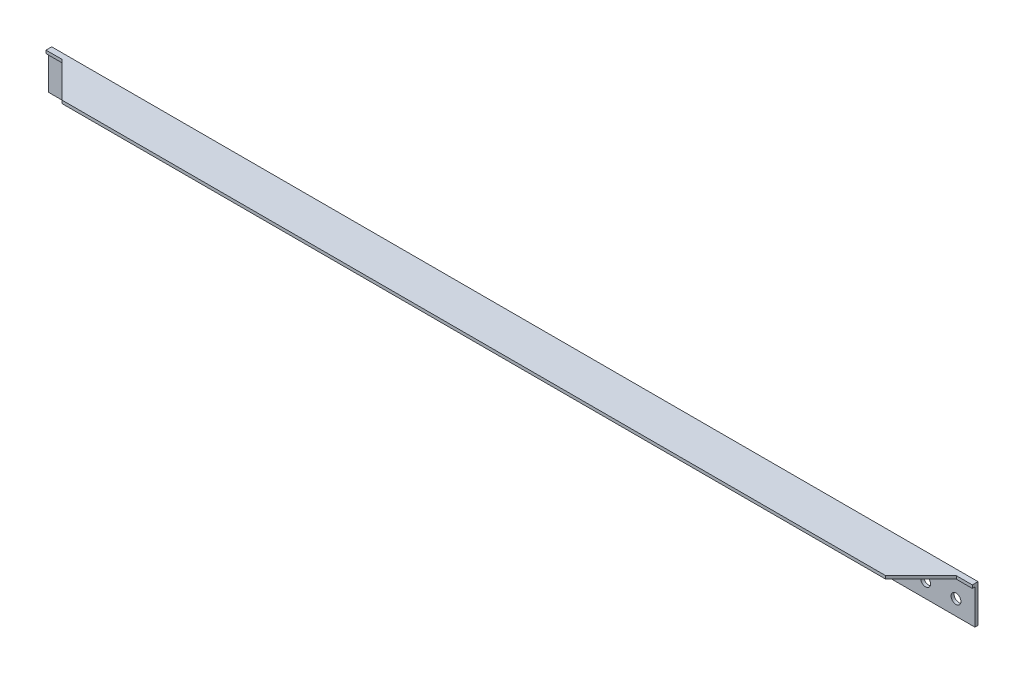
ISO-10303-21;
HEADER;
FILE_DESCRIPTION(('STEP AP214'),'2;1');
FILE_NAME('part.step','',(''),(''),'','','');
FILE_SCHEMA(('AUTOMOTIVE_DESIGN { 1 0 10303 214 1 1 1 1 }'));
ENDSEC;
DATA;
#1=APPLICATION_CONTEXT('core data for automotive mechanical design processes');
#2=APPLICATION_PROTOCOL_DEFINITION('international standard','automotive_design',2000,#1);
#3=PRODUCT_CONTEXT('',#1,'mechanical');
#4=PRODUCT('Part','Part','',(#3));
#5=PRODUCT_RELATED_PRODUCT_CATEGORY('part','',(#4));
#6=PRODUCT_DEFINITION_FORMATION('','',#4);
#7=PRODUCT_DEFINITION_CONTEXT('part definition',#1,'design');
#8=PRODUCT_DEFINITION('design','',#6,#7);
#9=PRODUCT_DEFINITION_SHAPE('','',#8);
#10=(LENGTH_UNIT() NAMED_UNIT(*) SI_UNIT(.MILLI.,.METRE.));
#11=(NAMED_UNIT(*) PLANE_ANGLE_UNIT() SI_UNIT($,.RADIAN.));
#12=(NAMED_UNIT(*) SI_UNIT($,.STERADIAN.) SOLID_ANGLE_UNIT());
#13=UNCERTAINTY_MEASURE_WITH_UNIT(LENGTH_MEASURE(1.E-05),#10,'distance_accuracy_value','');
#14=(GEOMETRIC_REPRESENTATION_CONTEXT(3) GLOBAL_UNCERTAINTY_ASSIGNED_CONTEXT((#13)) GLOBAL_UNIT_ASSIGNED_CONTEXT((#10,
#11,#12)) REPRESENTATION_CONTEXT('',''));
#15=CARTESIAN_POINT('',(0.,0.,0.));
#16=DIRECTION('',(0.,0.,1.));
#17=DIRECTION('',(1.,0.,0.));
#18=AXIS2_PLACEMENT_3D('',#15,#16,#17);
#19=CARTESIAN_POINT('',(-1220.,100.,8.));
#20=DIRECTION('',(0.,0.,-1.));
#21=DIRECTION('',(-1.,0.,0.));
#22=AXIS2_PLACEMENT_3D('',#19,#20,#21);
#23=PLANE('',#22);
#24=CARTESIAN_POINT('',(-80.,39.9999999999999,8.));
#25=DIRECTION('',(0.,0.,1.));
#26=DIRECTION('',(-1.,0.,0.));
#27=AXIS2_PLACEMENT_3D('',#24,#25,#26);
#28=CIRCLE('',#27,13.);
#29=CARTESIAN_POINT('',(-93.,39.9999999999999,8.));
#30=VERTEX_POINT('',#29);
#31=EDGE_CURVE('E143',#30,#30,#28,.T.);
#32=ORIENTED_EDGE('',*,*,#31,.F.);
#33=EDGE_LOOP('',(#32));
#34=FACE_BOUND('',#33,.T.);
#35=CARTESIAN_POINT('',(160.,39.9999999999999,8.));
#36=DIRECTION('',(0.,0.,1.));
#37=DIRECTION('',(1.,0.,0.));
#38=AXIS2_PLACEMENT_3D('',#35,#36,#37);
#39=CIRCLE('',#38,13.);
#40=CARTESIAN_POINT('',(173.,39.9999999999999,8.));
#41=VERTEX_POINT('',#40);
#42=EDGE_CURVE('E175',#41,#41,#39,.T.);
#43=ORIENTED_EDGE('',*,*,#42,.F.);
#44=EDGE_LOOP('',(#43));
#45=FACE_BOUND('',#44,.T.);
#46=CARTESIAN_POINT('',(0.,39.9999999999999,8.));
#47=DIRECTION('',(0.,0.,1.));
#48=DIRECTION('',(1.,0.,0.));
#49=AXIS2_PLACEMENT_3D('',#46,#47,#48);
#50=CIRCLE('',#49,13.);
#51=CARTESIAN_POINT('',(13.,39.9999999999999,8.));
#52=VERTEX_POINT('',#51);
#53=EDGE_CURVE('E187',#52,#52,#50,.T.);
#54=ORIENTED_EDGE('',*,*,#53,.F.);
#55=EDGE_LOOP('',(#54));
#56=FACE_BOUND('',#55,.T.);
#57=CARTESIAN_POINT('',(-1170.,40.,8.));
#58=DIRECTION('',(0.,0.,1.));
#59=DIRECTION('',(-1.,0.,0.));
#60=AXIS2_PLACEMENT_3D('',#57,#58,#59);
#61=CIRCLE('',#60,12.9999999999998);
#62=CARTESIAN_POINT('',(-1183.,40.,8.));
#63=VERTEX_POINT('',#62);
#64=EDGE_CURVE('E199',#63,#63,#61,.T.);
#65=ORIENTED_EDGE('',*,*,#64,.F.);
#66=EDGE_LOOP('',(#65));
#67=FACE_BOUND('',#66,.T.);
#68=CARTESIAN_POINT('',(1090.,40.,8.));
#69=DIRECTION('',(0.,0.,1.));
#70=DIRECTION('',(1.,0.,0.));
#71=AXIS2_PLACEMENT_3D('',#68,#69,#70);
#72=CIRCLE('',#71,12.9999999999998);
#73=CARTESIAN_POINT('',(1103.,40.,8.));
#74=VERTEX_POINT('',#73);
#75=EDGE_CURVE('E211',#74,#74,#72,.T.);
#76=ORIENTED_EDGE('',*,*,#75,.F.);
#77=EDGE_LOOP('',(#76));
#78=FACE_BOUND('',#77,.T.);
#79=CARTESIAN_POINT('',(1170.,40.,8.));
#80=DIRECTION('',(0.,0.,1.));
#81=DIRECTION('',(1.,0.,0.));
#82=AXIS2_PLACEMENT_3D('',#79,#80,#81);
#83=CIRCLE('',#82,12.9999999999998);
#84=CARTESIAN_POINT('',(1183.,40.,8.));
#85=VERTEX_POINT('',#84);
#86=EDGE_CURVE('E205',#85,#85,#83,.T.);
#87=ORIENTED_EDGE('',*,*,#86,.F.);
#88=EDGE_LOOP('',(#87));
#89=FACE_BOUND('',#88,.T.);
#90=CARTESIAN_POINT('',(-1090.,40.,8.));
#91=DIRECTION('',(0.,0.,1.));
#92=DIRECTION('',(-1.,0.,0.));
#93=AXIS2_PLACEMENT_3D('',#90,#91,#92);
#94=CIRCLE('',#93,12.9999999999998);
#95=CARTESIAN_POINT('',(-1103.,40.,8.));
#96=VERTEX_POINT('',#95);
#97=EDGE_CURVE('E193',#96,#96,#94,.T.);
#98=ORIENTED_EDGE('',*,*,#97,.F.);
#99=EDGE_LOOP('',(#98));
#100=FACE_BOUND('',#99,.T.);
#101=CARTESIAN_POINT('',(80.,39.9999999999999,8.));
#102=DIRECTION('',(0.,0.,1.));
#103=DIRECTION('',(1.,0.,0.));
#104=AXIS2_PLACEMENT_3D('',#101,#102,#103);
#105=CIRCLE('',#104,13.);
#106=CARTESIAN_POINT('',(93.,39.9999999999999,8.));
#107=VERTEX_POINT('',#106);
#108=EDGE_CURVE('E181',#107,#107,#105,.T.);
#109=ORIENTED_EDGE('',*,*,#108,.F.);
#110=EDGE_LOOP('',(#109));
#111=FACE_BOUND('',#110,.T.);
#112=CARTESIAN_POINT('',(-160.,39.9999999999999,8.));
#113=DIRECTION('',(0.,0.,1.));
#114=DIRECTION('',(-1.,0.,0.));
#115=AXIS2_PLACEMENT_3D('',#112,#113,#114);
#116=CIRCLE('',#115,13.);
#117=CARTESIAN_POINT('',(-173.,39.9999999999999,8.));
#118=VERTEX_POINT('',#117);
#119=EDGE_CURVE('E169',#118,#118,#116,.T.);
#120=ORIENTED_EDGE('',*,*,#119,.F.);
#121=EDGE_LOOP('',(#120));
#122=FACE_BOUND('',#121,.T.);
#123=DIRECTION('',(1.,0.,0.));
#124=VECTOR('',#123,1.);
#125=CARTESIAN_POINT('',(-1220.,92.,8.));
#126=LINE('',#125,#124);
#127=CARTESIAN_POINT('',(-1220.,92.,8.));
#128=VERTEX_POINT('',#127);
#129=CARTESIAN_POINT('',(1220.,92.,8.));
#130=VERTEX_POINT('',#129);
#131=EDGE_CURVE('E137',#128,#130,#126,.T.);
#132=ORIENTED_EDGE('',*,*,#131,.F.);
#133=DIRECTION('',(0.,-1.,0.));
#134=VECTOR('',#133,1.);
#135=CARTESIAN_POINT('',(-1220.,0.,8.));
#136=LINE('',#135,#134);
#137=CARTESIAN_POINT('',(-1220.,0.,8.));
#138=VERTEX_POINT('',#137);
#139=EDGE_CURVE('E220',#128,#138,#136,.T.);
#140=ORIENTED_EDGE('',*,*,#139,.T.);
#141=DIRECTION('',(1.,0.,0.));
#142=VECTOR('',#141,1.);
#143=CARTESIAN_POINT('',(-1220.,0.,8.));
#144=LINE('',#143,#142);
#145=CARTESIAN_POINT('',(1220.,0.,8.));
#146=VERTEX_POINT('',#145);
#147=EDGE_CURVE('E219',#138,#146,#144,.T.);
#148=ORIENTED_EDGE('',*,*,#147,.T.);
#149=DIRECTION('',(0.,1.,0.));
#150=VECTOR('',#149,1.);
#151=CARTESIAN_POINT('',(1220.,0.,8.));
#152=LINE('',#151,#150);
#153=EDGE_CURVE('E150',#146,#130,#152,.T.);
#154=ORIENTED_EDGE('',*,*,#153,.T.);
#155=EDGE_LOOP('',(#132,#140,#148,#154));
#156=FACE_BOUND('',#155,.T.);
#157=ADVANCED_FACE('F37',(#34,#45,#56,#67,#78,#89,#100,#111,#122,#156),#23,.F.);
#158=CARTESIAN_POINT('',(-1220.,100.,0.));
#159=DIRECTION('',(0.,0.,-1.));
#160=DIRECTION('',(-1.,0.,0.));
#161=AXIS2_PLACEMENT_3D('',#158,#159,#160);
#162=PLANE('',#161);
#163=CARTESIAN_POINT('',(-160.,39.9999999999999,0.));
#164=DIRECTION('',(0.,0.,1.));
#165=DIRECTION('',(-1.,0.,0.));
#166=AXIS2_PLACEMENT_3D('',#163,#164,#165);
#167=CIRCLE('',#166,13.);
#168=CARTESIAN_POINT('',(-173.,39.9999999999999,0.));
#169=VERTEX_POINT('',#168);
#170=EDGE_CURVE('E167',#169,#169,#167,.T.);
#171=ORIENTED_EDGE('',*,*,#170,.T.);
#172=EDGE_LOOP('',(#171));
#173=FACE_BOUND('',#172,.T.);
#174=CARTESIAN_POINT('',(80.,39.9999999999999,0.));
#175=DIRECTION('',(0.,0.,1.));
#176=DIRECTION('',(1.,0.,0.));
#177=AXIS2_PLACEMENT_3D('',#174,#175,#176);
#178=CIRCLE('',#177,13.);
#179=CARTESIAN_POINT('',(93.,39.9999999999999,0.));
#180=VERTEX_POINT('',#179);
#181=EDGE_CURVE('E178',#180,#180,#178,.T.);
#182=ORIENTED_EDGE('',*,*,#181,.T.);
#183=EDGE_LOOP('',(#182));
#184=FACE_BOUND('',#183,.T.);
#185=CARTESIAN_POINT('',(-1090.,40.,0.));
#186=DIRECTION('',(0.,0.,1.));
#187=DIRECTION('',(-1.,0.,0.));
#188=AXIS2_PLACEMENT_3D('',#185,#186,#187);
#189=CIRCLE('',#188,12.9999999999998);
#190=CARTESIAN_POINT('',(-1103.,40.,0.));
#191=VERTEX_POINT('',#190);
#192=EDGE_CURVE('E190',#191,#191,#189,.T.);
#193=ORIENTED_EDGE('',*,*,#192,.T.);
#194=EDGE_LOOP('',(#193));
#195=FACE_BOUND('',#194,.T.);
#196=CARTESIAN_POINT('',(1170.,40.,0.));
#197=DIRECTION('',(0.,0.,1.));
#198=DIRECTION('',(1.,0.,0.));
#199=AXIS2_PLACEMENT_3D('',#196,#197,#198);
#200=CIRCLE('',#199,12.9999999999998);
#201=CARTESIAN_POINT('',(1183.,40.,0.));
#202=VERTEX_POINT('',#201);
#203=EDGE_CURVE('E202',#202,#202,#200,.T.);
#204=ORIENTED_EDGE('',*,*,#203,.T.);
#205=EDGE_LOOP('',(#204));
#206=FACE_BOUND('',#205,.T.);
#207=DIRECTION('',(0.,-1.,0.));
#208=VECTOR('',#207,1.);
#209=CARTESIAN_POINT('',(-1220.,0.,0.));
#210=LINE('',#209,#208);
#211=CARTESIAN_POINT('',(-1220.,100.,0.));
#212=VERTEX_POINT('',#211);
#213=CARTESIAN_POINT('',(-1220.,0.,0.));
#214=VERTEX_POINT('',#213);
#215=EDGE_CURVE('E214',#212,#214,#210,.T.);
#216=ORIENTED_EDGE('',*,*,#215,.F.);
#217=DIRECTION('',(-1.,0.,0.));
#218=VECTOR('',#217,1.);
#219=CARTESIAN_POINT('',(-1220.,100.,0.));
#220=LINE('',#219,#218);
#221=CARTESIAN_POINT('',(1220.,100.,0.));
#222=VERTEX_POINT('',#221);
#223=EDGE_CURVE('E222',#222,#212,#220,.T.);
#224=ORIENTED_EDGE('',*,*,#223,.F.);
#225=DIRECTION('',(0.,1.,0.));
#226=VECTOR('',#225,1.);
#227=CARTESIAN_POINT('',(1220.,0.,0.));
#228=LINE('',#227,#226);
#229=CARTESIAN_POINT('',(1220.,0.,0.));
#230=VERTEX_POINT('',#229);
#231=EDGE_CURVE('E235',#230,#222,#228,.T.);
#232=ORIENTED_EDGE('',*,*,#231,.F.);
#233=DIRECTION('',(1.,0.,0.));
#234=VECTOR('',#233,1.);
#235=CARTESIAN_POINT('',(-1220.,0.,0.));
#236=LINE('',#235,#234);
#237=EDGE_CURVE('E238',#214,#230,#236,.T.);
#238=ORIENTED_EDGE('',*,*,#237,.F.);
#239=EDGE_LOOP('',(#216,#224,#232,#238));
#240=FACE_BOUND('',#239,.T.);
#241=CARTESIAN_POINT('',(1090.,40.,0.));
#242=DIRECTION('',(0.,0.,1.));
#243=DIRECTION('',(1.,0.,0.));
#244=AXIS2_PLACEMENT_3D('',#241,#242,#243);
#245=CIRCLE('',#244,12.9999999999998);
#246=CARTESIAN_POINT('',(1103.,40.,0.));
#247=VERTEX_POINT('',#246);
#248=EDGE_CURVE('E208',#247,#247,#245,.T.);
#249=ORIENTED_EDGE('',*,*,#248,.T.);
#250=EDGE_LOOP('',(#249));
#251=FACE_BOUND('',#250,.T.);
#252=CARTESIAN_POINT('',(-1170.,40.,0.));
#253=DIRECTION('',(0.,0.,1.));
#254=DIRECTION('',(-1.,0.,0.));
#255=AXIS2_PLACEMENT_3D('',#252,#253,#254);
#256=CIRCLE('',#255,12.9999999999998);
#257=CARTESIAN_POINT('',(-1183.,40.,0.));
#258=VERTEX_POINT('',#257);
#259=EDGE_CURVE('E196',#258,#258,#256,.T.);
#260=ORIENTED_EDGE('',*,*,#259,.T.);
#261=EDGE_LOOP('',(#260));
#262=FACE_BOUND('',#261,.T.);
#263=CARTESIAN_POINT('',(0.,39.9999999999999,0.));
#264=DIRECTION('',(0.,0.,1.));
#265=DIRECTION('',(1.,0.,0.));
#266=AXIS2_PLACEMENT_3D('',#263,#264,#265);
#267=CIRCLE('',#266,13.);
#268=CARTESIAN_POINT('',(13.,39.9999999999999,0.));
#269=VERTEX_POINT('',#268);
#270=EDGE_CURVE('E184',#269,#269,#267,.T.);
#271=ORIENTED_EDGE('',*,*,#270,.T.);
#272=EDGE_LOOP('',(#271));
#273=FACE_BOUND('',#272,.T.);
#274=CARTESIAN_POINT('',(160.,39.9999999999999,0.));
#275=DIRECTION('',(0.,0.,1.));
#276=DIRECTION('',(1.,0.,0.));
#277=AXIS2_PLACEMENT_3D('',#274,#275,#276);
#278=CIRCLE('',#277,13.);
#279=CARTESIAN_POINT('',(173.,39.9999999999999,0.));
#280=VERTEX_POINT('',#279);
#281=EDGE_CURVE('E172',#280,#280,#278,.T.);
#282=ORIENTED_EDGE('',*,*,#281,.T.);
#283=EDGE_LOOP('',(#282));
#284=FACE_BOUND('',#283,.T.);
#285=CARTESIAN_POINT('',(-80.,39.9999999999999,0.));
#286=DIRECTION('',(0.,0.,1.));
#287=DIRECTION('',(-1.,0.,0.));
#288=AXIS2_PLACEMENT_3D('',#285,#286,#287);
#289=CIRCLE('',#288,13.);
#290=CARTESIAN_POINT('',(-93.,39.9999999999999,0.));
#291=VERTEX_POINT('',#290);
#292=EDGE_CURVE('E159',#291,#291,#289,.T.);
#293=ORIENTED_EDGE('',*,*,#292,.T.);
#294=EDGE_LOOP('',(#293));
#295=FACE_BOUND('',#294,.T.);
#296=ADVANCED_FACE('F249',(#173,#184,#195,#206,#240,#251,#262,#273,#284,#295),#162,.T.);
#297=CARTESIAN_POINT('',(-1220.,0.,8.));
#298=DIRECTION('',(1.,0.,0.));
#299=DIRECTION('',(0.,0.,-1.));
#300=AXIS2_PLACEMENT_3D('',#297,#298,#299);
#301=PLANE('',#300);
#302=DIRECTION('',(0.,0.,-1.));
#303=VECTOR('',#302,1.);
#304=CARTESIAN_POINT('',(-1220.,92.,108.));
#305=LINE('',#304,#303);
#306=CARTESIAN_POINT('',(-1220.,92.,15.));
#307=VERTEX_POINT('',#306);
#308=EDGE_CURVE('E135',#307,#128,#305,.T.);
#309=ORIENTED_EDGE('',*,*,#308,.F.);
#310=DIRECTION('',(0.,1.,0.));
#311=VECTOR('',#310,1.);
#312=CARTESIAN_POINT('',(-1220.,-2.50000000007189E-05,15.));
#313=LINE('',#312,#311);
#314=CARTESIAN_POINT('',(-1220.,100.,15.));
#315=VERTEX_POINT('',#314);
#316=EDGE_CURVE('E279',#307,#315,#313,.T.);
#317=ORIENTED_EDGE('',*,*,#316,.T.);
#318=DIRECTION('',(0.,0.,-1.));
#319=VECTOR('',#318,1.);
#320=CARTESIAN_POINT('',(-1220.,100.,8.));
#321=LINE('',#320,#319);
#322=EDGE_CURVE('E231',#315,#212,#321,.T.);
#323=ORIENTED_EDGE('',*,*,#322,.T.);
#324=ORIENTED_EDGE('',*,*,#215,.T.);
#325=DIRECTION('',(0.,0.,-1.));
#326=VECTOR('',#325,1.);
#327=CARTESIAN_POINT('',(-1220.,0.,8.));
#328=LINE('',#327,#326);
#329=EDGE_CURVE('E223',#138,#214,#328,.T.);
#330=ORIENTED_EDGE('',*,*,#329,.F.);
#331=ORIENTED_EDGE('',*,*,#139,.F.);
#332=EDGE_LOOP('',(#309,#317,#323,#324,#330,#331));
#333=FACE_BOUND('',#332,.T.);
#334=ADVANCED_FACE('F39',(#333),#301,.F.);
#335=CARTESIAN_POINT('',(-1220.,0.,8.));
#336=DIRECTION('',(0.,1.,0.));
#337=DIRECTION('',(0.,0.,1.));
#338=AXIS2_PLACEMENT_3D('',#335,#336,#337);
#339=PLANE('',#338);
#340=ORIENTED_EDGE('',*,*,#237,.T.);
#341=DIRECTION('',(0.,0.,-1.));
#342=VECTOR('',#341,1.);
#343=CARTESIAN_POINT('',(1220.,0.,8.));
#344=LINE('',#343,#342);
#345=EDGE_CURVE('E226',#146,#230,#344,.T.);
#346=ORIENTED_EDGE('',*,*,#345,.F.);
#347=ORIENTED_EDGE('',*,*,#147,.F.);
#348=ORIENTED_EDGE('',*,*,#329,.T.);
#349=EDGE_LOOP('',(#340,#346,#347,#348));
#350=FACE_BOUND('',#349,.T.);
#351=ADVANCED_FACE('F255',(#350),#339,.F.);
#352=CARTESIAN_POINT('',(1220.,0.,8.));
#353=DIRECTION('',(-1.,0.,0.));
#354=DIRECTION('',(0.,0.,1.));
#355=AXIS2_PLACEMENT_3D('',#352,#353,#354);
#356=PLANE('',#355);
#357=DIRECTION('',(0.,0.,-1.));
#358=VECTOR('',#357,1.);
#359=CARTESIAN_POINT('',(1220.,100.,8.));
#360=LINE('',#359,#358);
#361=CARTESIAN_POINT('',(1220.,100.,15.));
#362=VERTEX_POINT('',#361);
#363=EDGE_CURVE('E229',#362,#222,#360,.T.);
#364=ORIENTED_EDGE('',*,*,#363,.F.);
#365=DIRECTION('',(0.,1.,0.));
#366=VECTOR('',#365,1.);
#367=CARTESIAN_POINT('',(1220.,-2.50000000007189E-05,15.));
#368=LINE('',#367,#366);
#369=CARTESIAN_POINT('',(1220.,92.,15.));
#370=VERTEX_POINT('',#369);
#371=EDGE_CURVE('E266',#370,#362,#368,.T.);
#372=ORIENTED_EDGE('',*,*,#371,.F.);
#373=DIRECTION('',(0.,0.,-1.));
#374=VECTOR('',#373,1.);
#375=CARTESIAN_POINT('',(1220.,92.,108.));
#376=LINE('',#375,#374);
#377=EDGE_CURVE('E132',#370,#130,#376,.T.);
#378=ORIENTED_EDGE('',*,*,#377,.T.);
#379=ORIENTED_EDGE('',*,*,#153,.F.);
#380=ORIENTED_EDGE('',*,*,#345,.T.);
#381=ORIENTED_EDGE('',*,*,#231,.T.);
#382=EDGE_LOOP('',(#364,#372,#378,#379,#380,#381));
#383=FACE_BOUND('',#382,.T.);
#384=ADVANCED_FACE('F265',(#383),#356,.F.);
#385=CARTESIAN_POINT('',(-1220.,100.,8.));
#386=DIRECTION('',(0.,-1.,0.));
#387=DIRECTION('',(0.,0.,-1.));
#388=AXIS2_PLACEMENT_3D('',#385,#386,#387);
#389=PLANE('',#388);
#390=ORIENTED_EDGE('',*,*,#322,.F.);
#391=DIRECTION('',(-1.,0.,0.));
#392=VECTOR('',#391,1.);
#393=CARTESIAN_POINT('',(-1220.,100.,15.));
#394=LINE('',#393,#392);
#395=CARTESIAN_POINT('',(-1178.,100.,15.));
#396=VERTEX_POINT('',#395);
#397=EDGE_CURVE('E128',#396,#315,#394,.T.);
#398=ORIENTED_EDGE('',*,*,#397,.F.);
#399=DIRECTION('',(-0.707106781186552,0.,-0.707106781186543));
#400=VECTOR('',#399,1.);
#401=CARTESIAN_POINT('',(-1085.,100.,108.));
#402=LINE('',#401,#400);
#403=CARTESIAN_POINT('',(-1085.,100.,108.));
#404=VERTEX_POINT('',#403);
#405=EDGE_CURVE('E116',#404,#396,#402,.T.);
#406=ORIENTED_EDGE('',*,*,#405,.F.);
#407=DIRECTION('',(-1.,0.,0.));
#408=VECTOR('',#407,1.);
#409=CARTESIAN_POINT('',(-1220.,100.,108.));
#410=LINE('',#409,#408);
#411=CARTESIAN_POINT('',(1085.,100.,108.));
#412=VERTEX_POINT('',#411);
#413=EDGE_CURVE('E127',#412,#404,#410,.T.);
#414=ORIENTED_EDGE('',*,*,#413,.F.);
#415=DIRECTION('',(-0.707106781186551,0.,0.707106781186544));
#416=VECTOR('',#415,1.);
#417=CARTESIAN_POINT('',(1085.,100.,108.));
#418=LINE('',#417,#416);
#419=CARTESIAN_POINT('',(1178.,100.,15.));
#420=VERTEX_POINT('',#419);
#421=EDGE_CURVE('E60',#420,#412,#418,.T.);
#422=ORIENTED_EDGE('',*,*,#421,.F.);
#423=DIRECTION('',(-1.,0.,0.));
#424=VECTOR('',#423,1.);
#425=CARTESIAN_POINT('',(1220.,100.,15.));
#426=LINE('',#425,#424);
#427=EDGE_CURVE('E273',#362,#420,#426,.T.);
#428=ORIENTED_EDGE('',*,*,#427,.F.);
#429=ORIENTED_EDGE('',*,*,#363,.T.);
#430=ORIENTED_EDGE('',*,*,#223,.T.);
#431=EDGE_LOOP('',(#390,#398,#406,#414,#422,#428,#429,#430));
#432=FACE_BOUND('',#431,.T.);
#433=ADVANCED_FACE('F126',(#432),#389,.F.);
#434=CARTESIAN_POINT('',(1090.,40.,8.));
#435=DIRECTION('',(0.,0.,-1.));
#436=DIRECTION('',(-1.,0.,0.));
#437=AXIS2_PLACEMENT_3D('',#434,#435,#436);
#438=CYLINDRICAL_SURFACE('',#437,12.9999999999998);
#439=ORIENTED_EDGE('',*,*,#75,.T.);
#440=EDGE_LOOP('',(#439));
#441=FACE_BOUND('',#440,.T.);
#442=ORIENTED_EDGE('',*,*,#248,.F.);
#443=EDGE_LOOP('',(#442));
#444=FACE_BOUND('',#443,.T.);
#445=ADVANCED_FACE('F306',(#441,#444),#438,.F.);
#446=CARTESIAN_POINT('',(1170.,40.,8.));
#447=DIRECTION('',(0.,0.,-1.));
#448=DIRECTION('',(-1.,0.,0.));
#449=AXIS2_PLACEMENT_3D('',#446,#447,#448);
#450=CYLINDRICAL_SURFACE('',#449,12.9999999999998);
#451=ORIENTED_EDGE('',*,*,#86,.T.);
#452=EDGE_LOOP('',(#451));
#453=FACE_BOUND('',#452,.T.);
#454=ORIENTED_EDGE('',*,*,#203,.F.);
#455=EDGE_LOOP('',(#454));
#456=FACE_BOUND('',#455,.T.);
#457=ADVANCED_FACE('F338',(#453,#456),#450,.F.);
#458=CARTESIAN_POINT('',(-1170.,40.,8.));
#459=DIRECTION('',(0.,0.,-1.));
#460=DIRECTION('',(-1.,0.,0.));
#461=AXIS2_PLACEMENT_3D('',#458,#459,#460);
#462=CYLINDRICAL_SURFACE('',#461,12.9999999999998);
#463=ORIENTED_EDGE('',*,*,#64,.T.);
#464=EDGE_LOOP('',(#463));
#465=FACE_BOUND('',#464,.T.);
#466=ORIENTED_EDGE('',*,*,#259,.F.);
#467=EDGE_LOOP('',(#466));
#468=FACE_BOUND('',#467,.T.);
#469=ADVANCED_FACE('F348',(#465,#468),#462,.F.);
#470=CARTESIAN_POINT('',(-1090.,40.,8.));
#471=DIRECTION('',(0.,0.,-1.));
#472=DIRECTION('',(-1.,0.,0.));
#473=AXIS2_PLACEMENT_3D('',#470,#471,#472);
#474=CYLINDRICAL_SURFACE('',#473,12.9999999999998);
#475=ORIENTED_EDGE('',*,*,#97,.T.);
#476=EDGE_LOOP('',(#475));
#477=FACE_BOUND('',#476,.T.);
#478=ORIENTED_EDGE('',*,*,#192,.F.);
#479=EDGE_LOOP('',(#478));
#480=FACE_BOUND('',#479,.T.);
#481=ADVANCED_FACE('F357',(#477,#480),#474,.F.);
#482=CARTESIAN_POINT('',(0.,39.9999999999999,8.));
#483=DIRECTION('',(0.,0.,-1.));
#484=DIRECTION('',(-1.,0.,0.));
#485=AXIS2_PLACEMENT_3D('',#482,#483,#484);
#486=CYLINDRICAL_SURFACE('',#485,13.);
#487=ORIENTED_EDGE('',*,*,#53,.T.);
#488=EDGE_LOOP('',(#487));
#489=FACE_BOUND('',#488,.T.);
#490=ORIENTED_EDGE('',*,*,#270,.F.);
#491=EDGE_LOOP('',(#490));
#492=FACE_BOUND('',#491,.T.);
#493=ADVANCED_FACE('F367',(#489,#492),#486,.F.);
#494=CARTESIAN_POINT('',(80.,39.9999999999999,8.));
#495=DIRECTION('',(0.,0.,-1.));
#496=DIRECTION('',(-1.,0.,0.));
#497=AXIS2_PLACEMENT_3D('',#494,#495,#496);
#498=CYLINDRICAL_SURFACE('',#497,13.);
#499=ORIENTED_EDGE('',*,*,#108,.T.);
#500=EDGE_LOOP('',(#499));
#501=FACE_BOUND('',#500,.T.);
#502=ORIENTED_EDGE('',*,*,#181,.F.);
#503=EDGE_LOOP('',(#502));
#504=FACE_BOUND('',#503,.T.);
#505=ADVANCED_FACE('F377',(#501,#504),#498,.F.);
#506=CARTESIAN_POINT('',(160.,39.9999999999999,8.));
#507=DIRECTION('',(0.,0.,-1.));
#508=DIRECTION('',(-1.,0.,0.));
#509=AXIS2_PLACEMENT_3D('',#506,#507,#508);
#510=CYLINDRICAL_SURFACE('',#509,13.);
#511=ORIENTED_EDGE('',*,*,#42,.T.);
#512=EDGE_LOOP('',(#511));
#513=FACE_BOUND('',#512,.T.);
#514=ORIENTED_EDGE('',*,*,#281,.F.);
#515=EDGE_LOOP('',(#514));
#516=FACE_BOUND('',#515,.T.);
#517=ADVANCED_FACE('F387',(#513,#516),#510,.F.);
#518=CARTESIAN_POINT('',(-160.,39.9999999999999,8.));
#519=DIRECTION('',(0.,0.,-1.));
#520=DIRECTION('',(-1.,0.,0.));
#521=AXIS2_PLACEMENT_3D('',#518,#519,#520);
#522=CYLINDRICAL_SURFACE('',#521,13.);
#523=ORIENTED_EDGE('',*,*,#119,.T.);
#524=EDGE_LOOP('',(#523));
#525=FACE_BOUND('',#524,.T.);
#526=ORIENTED_EDGE('',*,*,#170,.F.);
#527=EDGE_LOOP('',(#526));
#528=FACE_BOUND('',#527,.T.);
#529=ADVANCED_FACE('F397',(#525,#528),#522,.F.);
#530=CARTESIAN_POINT('',(-80.,39.9999999999999,8.));
#531=DIRECTION('',(0.,0.,-1.));
#532=DIRECTION('',(-1.,0.,0.));
#533=AXIS2_PLACEMENT_3D('',#530,#531,#532);
#534=CYLINDRICAL_SURFACE('',#533,13.);
#535=ORIENTED_EDGE('',*,*,#31,.T.);
#536=EDGE_LOOP('',(#535));
#537=FACE_BOUND('',#536,.T.);
#538=ORIENTED_EDGE('',*,*,#292,.F.);
#539=EDGE_LOOP('',(#538));
#540=FACE_BOUND('',#539,.T.);
#541=ADVANCED_FACE('F407',(#537,#540),#534,.F.);
#542=CARTESIAN_POINT('',(-1220.,92.,108.));
#543=DIRECTION('',(0.,1.,0.));
#544=DIRECTION('',(0.,0.,1.));
#545=AXIS2_PLACEMENT_3D('',#542,#543,#544);
#546=PLANE('',#545);
#547=DIRECTION('',(-0.707106781186552,0.,-0.707106781186543));
#548=VECTOR('',#547,1.);
#549=CARTESIAN_POINT('',(-1152.5,92.,40.5));
#550=LINE('',#549,#548);
#551=CARTESIAN_POINT('',(-1085.,92.,108.));
#552=VERTEX_POINT('',#551);
#553=CARTESIAN_POINT('',(-1178.,92.,15.));
#554=VERTEX_POINT('',#553);
#555=EDGE_CURVE('E52',#552,#554,#550,.T.);
#556=ORIENTED_EDGE('',*,*,#555,.T.);
#557=DIRECTION('',(-1.,0.,0.));
#558=VECTOR('',#557,1.);
#559=CARTESIAN_POINT('',(-1220.,92.,15.));
#560=LINE('',#559,#558);
#561=EDGE_CURVE('E11',#554,#307,#560,.T.);
#562=ORIENTED_EDGE('',*,*,#561,.T.);
#563=ORIENTED_EDGE('',*,*,#308,.T.);
#564=ORIENTED_EDGE('',*,*,#131,.T.);
#565=ORIENTED_EDGE('',*,*,#377,.F.);
#566=DIRECTION('',(-1.,0.,0.));
#567=VECTOR('',#566,1.);
#568=CARTESIAN_POINT('',(-1220.,92.,15.0000000000007));
#569=LINE('',#568,#567);
#570=CARTESIAN_POINT('',(1178.,92.,15.));
#571=VERTEX_POINT('',#570);
#572=EDGE_CURVE('E121',#370,#571,#569,.T.);
#573=ORIENTED_EDGE('',*,*,#572,.T.);
#574=DIRECTION('',(-0.707106781186551,0.,0.707106781186544));
#575=VECTOR('',#574,1.);
#576=CARTESIAN_POINT('',(-67.5000000000108,92.,1260.5));
#577=LINE('',#576,#575);
#578=CARTESIAN_POINT('',(1085.,92.,108.));
#579=VERTEX_POINT('',#578);
#580=EDGE_CURVE('E149',#571,#579,#577,.T.);
#581=ORIENTED_EDGE('',*,*,#580,.T.);
#582=DIRECTION('',(1.,0.,0.));
#583=VECTOR('',#582,1.);
#584=CARTESIAN_POINT('',(-1220.,92.,108.));
#585=LINE('',#584,#583);
#586=EDGE_CURVE('E133',#552,#579,#585,.T.);
#587=ORIENTED_EDGE('',*,*,#586,.F.);
#588=EDGE_LOOP('',(#556,#562,#563,#564,#565,#573,#581,#587));
#589=FACE_BOUND('',#588,.T.);
#590=ADVANCED_FACE('F261',(#589),#546,.F.);
#591=CARTESIAN_POINT('',(-1220.,92.,108.));
#592=DIRECTION('',(0.,0.,1.));
#593=DIRECTION('',(1.,0.,0.));
#594=AXIS2_PLACEMENT_3D('',#591,#592,#593);
#595=PLANE('',#594);
#596=DIRECTION('',(0.,1.,0.));
#597=VECTOR('',#596,1.);
#598=CARTESIAN_POINT('',(-1085.,92.,108.));
#599=LINE('',#598,#597);
#600=EDGE_CURVE('E45',#552,#404,#599,.T.);
#601=ORIENTED_EDGE('',*,*,#600,.F.);
#602=ORIENTED_EDGE('',*,*,#586,.T.);
#603=DIRECTION('',(0.,-1.,0.));
#604=VECTOR('',#603,1.);
#605=CARTESIAN_POINT('',(1085.,92.,108.));
#606=LINE('',#605,#604);
#607=EDGE_CURVE('E131',#412,#579,#606,.T.);
#608=ORIENTED_EDGE('',*,*,#607,.F.);
#609=ORIENTED_EDGE('',*,*,#413,.T.);
#610=EDGE_LOOP('',(#601,#602,#608,#609));
#611=FACE_BOUND('',#610,.T.);
#612=ADVANCED_FACE('F130',(#611),#595,.T.);
#613=CARTESIAN_POINT('',(1220.,-2.50000000007189E-05,15.));
#614=DIRECTION('',(0.,0.,-1.));
#615=DIRECTION('',(-1.,0.,0.));
#616=AXIS2_PLACEMENT_3D('',#613,#614,#615);
#617=PLANE('',#616);
#618=ORIENTED_EDGE('',*,*,#371,.T.);
#619=ORIENTED_EDGE('',*,*,#427,.T.);
#620=DIRECTION('',(0.,1.,0.));
#621=VECTOR('',#620,1.);
#622=CARTESIAN_POINT('',(1178.,-2.50000000007189E-05,15.));
#623=LINE('',#622,#621);
#624=EDGE_CURVE('E270',#571,#420,#623,.T.);
#625=ORIENTED_EDGE('',*,*,#624,.F.);
#626=ORIENTED_EDGE('',*,*,#572,.F.);
#627=EDGE_LOOP('',(#618,#619,#625,#626));
#628=FACE_BOUND('',#627,.T.);
#629=ADVANCED_FACE('F277',(#628),#617,.F.);
#630=CARTESIAN_POINT('',(1085.,-2.50000000007189E-05,108.));
#631=DIRECTION('',(-0.707106781186544,0.,-0.707106781186551));
#632=DIRECTION('',(-0.707106781186551,0.,0.707106781186544));
#633=AXIS2_PLACEMENT_3D('',#630,#631,#632);
#634=PLANE('',#633);
#635=ORIENTED_EDGE('',*,*,#624,.T.);
#636=ORIENTED_EDGE('',*,*,#421,.T.);
#637=ORIENTED_EDGE('',*,*,#607,.T.);
#638=ORIENTED_EDGE('',*,*,#580,.F.);
#639=EDGE_LOOP('',(#635,#636,#637,#638));
#640=FACE_BOUND('',#639,.T.);
#641=ADVANCED_FACE('F276',(#640),#634,.F.);
#642=CARTESIAN_POINT('',(-1220.,-2.50000000007189E-05,15.));
#643=DIRECTION('',(0.,0.,-1.));
#644=DIRECTION('',(-1.,0.,0.));
#645=AXIS2_PLACEMENT_3D('',#642,#643,#644);
#646=PLANE('',#645);
#647=DIRECTION('',(0.,1.,0.));
#648=VECTOR('',#647,1.);
#649=CARTESIAN_POINT('',(-1178.,-2.50000000007189E-05,15.));
#650=LINE('',#649,#648);
#651=EDGE_CURVE('E282',#554,#396,#650,.T.);
#652=ORIENTED_EDGE('',*,*,#651,.T.);
#653=ORIENTED_EDGE('',*,*,#397,.T.);
#654=ORIENTED_EDGE('',*,*,#316,.F.);
#655=ORIENTED_EDGE('',*,*,#561,.F.);
#656=EDGE_LOOP('',(#652,#653,#654,#655));
#657=FACE_BOUND('',#656,.T.);
#658=ADVANCED_FACE('F286',(#657),#646,.F.);
#659=CARTESIAN_POINT('',(-1085.,-2.50000000007189E-05,108.));
#660=DIRECTION('',(0.707106781186543,0.,-0.707106781186552));
#661=DIRECTION('',(-0.707106781186552,0.,-0.707106781186543));
#662=AXIS2_PLACEMENT_3D('',#659,#660,#661);
#663=PLANE('',#662);
#664=ORIENTED_EDGE('',*,*,#600,.T.);
#665=ORIENTED_EDGE('',*,*,#405,.T.);
#666=ORIENTED_EDGE('',*,*,#651,.F.);
#667=ORIENTED_EDGE('',*,*,#555,.F.);
#668=EDGE_LOOP('',(#664,#665,#666,#667));
#669=FACE_BOUND('',#668,.T.);
#670=ADVANCED_FACE('F115',(#669),#663,.F.);
#671=CLOSED_SHELL('',(#157,#296,#334,#351,#384,#433,#445,#457,#469,#481,#493,#505,#517,#529,
#541,#590,#612,#629,#641,#658,#670));
#672=MANIFOLD_SOLID_BREP('B2',#671);
#673=ADVANCED_BREP_SHAPE_REPRESENTATION('',(#18,#672),#14);
#674=SHAPE_DEFINITION_REPRESENTATION(#9,#673);
ENDSEC;
END-ISO-10303-21;
